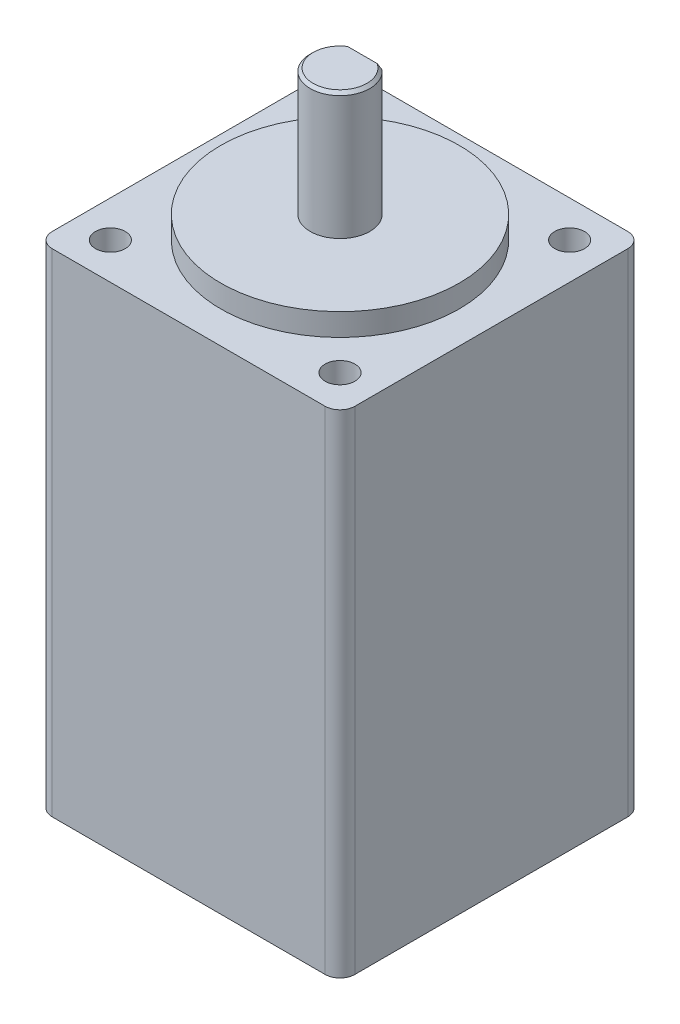
ISO-10303-21;
HEADER;
FILE_DESCRIPTION(('STEP AP214'),'2;1');
FILE_NAME('part.step','',(''),(''),'','','');
FILE_SCHEMA(('AUTOMOTIVE_DESIGN { 1 0 10303 214 1 1 1 1 }'));
ENDSEC;
DATA;
#1=APPLICATION_CONTEXT('core data for automotive mechanical design processes');
#2=APPLICATION_PROTOCOL_DEFINITION('international standard','automotive_design',2000,#1);
#3=PRODUCT_CONTEXT('',#1,'mechanical');
#4=PRODUCT('Part','Part','',(#3));
#5=PRODUCT_RELATED_PRODUCT_CATEGORY('part','',(#4));
#6=PRODUCT_DEFINITION_FORMATION('','',#4);
#7=PRODUCT_DEFINITION_CONTEXT('part definition',#1,'design');
#8=PRODUCT_DEFINITION('design','',#6,#7);
#9=PRODUCT_DEFINITION_SHAPE('','',#8);
#10=(LENGTH_UNIT() NAMED_UNIT(*) SI_UNIT(.MILLI.,.METRE.));
#11=(NAMED_UNIT(*) PLANE_ANGLE_UNIT() SI_UNIT($,.RADIAN.));
#12=(NAMED_UNIT(*) SI_UNIT($,.STERADIAN.) SOLID_ANGLE_UNIT());
#13=UNCERTAINTY_MEASURE_WITH_UNIT(LENGTH_MEASURE(1.E-05),#10,'distance_accuracy_value','');
#14=(GEOMETRIC_REPRESENTATION_CONTEXT(3) GLOBAL_UNCERTAINTY_ASSIGNED_CONTEXT((#13)) GLOBAL_UNIT_ASSIGNED_CONTEXT((#10,
#11,#12)) REPRESENTATION_CONTEXT('',''));
#15=CARTESIAN_POINT('',(0.,0.,0.));
#16=DIRECTION('',(0.,0.,1.));
#17=DIRECTION('',(1.,0.,0.));
#18=AXIS2_PLACEMENT_3D('',#15,#16,#17);
#19=CARTESIAN_POINT('',(0.,33.,0.));
#20=DIRECTION('',(0.,1.,0.));
#21=DIRECTION('',(1.,0.,0.));
#22=AXIS2_PLACEMENT_3D('',#19,#20,#21);
#23=PLANE('',#22);
#24=CARTESIAN_POINT('',(0.,33.,0.));
#25=DIRECTION('',(0.,-1.,0.));
#26=DIRECTION('',(-1.,0.,0.));
#27=AXIS2_PLACEMENT_3D('',#24,#25,#26);
#28=CIRCLE('',#27,8.);
#29=CARTESIAN_POINT('',(8.,33.,0.));
#30=VERTEX_POINT('',#29);
#31=EDGE_CURVE('E238',#30,#30,#28,.T.);
#32=ORIENTED_EDGE('',*,*,#31,.T.);
#33=EDGE_LOOP('',(#32));
#34=FACE_BOUND('',#33,.T.);
#35=CARTESIAN_POINT('',(-7.7,33.,7.7));
#36=DIRECTION('',(0.,-1.,0.));
#37=DIRECTION('',(-1.,0.,0.));
#38=AXIS2_PLACEMENT_3D('',#35,#36,#37);
#39=CIRCLE('',#38,1.);
#40=CARTESIAN_POINT('',(-6.7,33.,7.7));
#41=VERTEX_POINT('',#40);
#42=EDGE_CURVE('E282',#41,#41,#39,.T.);
#43=ORIENTED_EDGE('',*,*,#42,.T.);
#44=EDGE_LOOP('',(#43));
#45=FACE_BOUND('',#44,.T.);
#46=CARTESIAN_POINT('',(7.7,33.,7.7));
#47=DIRECTION('',(0.,-1.,0.));
#48=DIRECTION('',(-1.,0.,0.));
#49=AXIS2_PLACEMENT_3D('',#46,#47,#48);
#50=CIRCLE('',#49,1.);
#51=CARTESIAN_POINT('',(8.7,33.,7.7));
#52=VERTEX_POINT('',#51);
#53=EDGE_CURVE('E377',#52,#52,#50,.T.);
#54=ORIENTED_EDGE('',*,*,#53,.T.);
#55=EDGE_LOOP('',(#54));
#56=FACE_BOUND('',#55,.T.);
#57=CARTESIAN_POINT('',(-7.7,33.,-7.7));
#58=DIRECTION('',(0.,-1.,0.));
#59=DIRECTION('',(-1.,0.,0.));
#60=AXIS2_PLACEMENT_3D('',#57,#58,#59);
#61=CIRCLE('',#60,1.);
#62=CARTESIAN_POINT('',(-6.7,33.,-7.7));
#63=VERTEX_POINT('',#62);
#64=EDGE_CURVE('E288',#63,#63,#61,.T.);
#65=ORIENTED_EDGE('',*,*,#64,.T.);
#66=EDGE_LOOP('',(#65));
#67=FACE_BOUND('',#66,.T.);
#68=CARTESIAN_POINT('',(7.7,33.,-7.7));
#69=DIRECTION('',(0.,-1.,0.));
#70=DIRECTION('',(-1.,0.,0.));
#71=AXIS2_PLACEMENT_3D('',#68,#69,#70);
#72=CIRCLE('',#71,1.);
#73=CARTESIAN_POINT('',(8.7,33.,-7.7));
#74=VERTEX_POINT('',#73);
#75=EDGE_CURVE('E365',#74,#74,#72,.T.);
#76=ORIENTED_EDGE('',*,*,#75,.T.);
#77=EDGE_LOOP('',(#76));
#78=FACE_BOUND('',#77,.T.);
#79=CARTESIAN_POINT('',(-9.15,33.,-9.15));
#80=DIRECTION('',(0.,-1.,0.));
#81=DIRECTION('',(-0.707106781186548,0.,-0.707106781186548));
#82=AXIS2_PLACEMENT_3D('',#79,#80,#81);
#83=CIRCLE('',#82,1.);
#84=CARTESIAN_POINT('',(-10.15,33.,-9.15));
#85=VERTEX_POINT('',#84);
#86=CARTESIAN_POINT('',(-9.15,33.,-10.15));
#87=VERTEX_POINT('',#86);
#88=EDGE_CURVE('E221',#85,#87,#83,.T.);
#89=ORIENTED_EDGE('',*,*,#88,.F.);
#90=DIRECTION('',(0.,0.,1.));
#91=VECTOR('',#90,1.);
#92=CARTESIAN_POINT('',(-10.15,33.,10.15));
#93=LINE('',#92,#91);
#94=CARTESIAN_POINT('',(-10.15,33.,9.15));
#95=VERTEX_POINT('',#94);
#96=EDGE_CURVE('E294',#85,#95,#93,.T.);
#97=ORIENTED_EDGE('',*,*,#96,.T.);
#98=CARTESIAN_POINT('',(-9.15,33.,9.15));
#99=DIRECTION('',(0.,-1.,0.));
#100=DIRECTION('',(-0.707106781186548,0.,0.707106781186548));
#101=AXIS2_PLACEMENT_3D('',#98,#99,#100);
#102=CIRCLE('',#101,1.);
#103=CARTESIAN_POINT('',(-9.15,33.,10.15));
#104=VERTEX_POINT('',#103);
#105=EDGE_CURVE('E274',#104,#95,#102,.T.);
#106=ORIENTED_EDGE('',*,*,#105,.F.);
#107=DIRECTION('',(1.,0.,0.));
#108=VECTOR('',#107,1.);
#109=CARTESIAN_POINT('',(10.15,33.,10.15));
#110=LINE('',#109,#108);
#111=CARTESIAN_POINT('',(9.15,33.,10.15));
#112=VERTEX_POINT('',#111);
#113=EDGE_CURVE('E301',#104,#112,#110,.T.);
#114=ORIENTED_EDGE('',*,*,#113,.T.);
#115=CARTESIAN_POINT('',(9.15,33.,9.15));
#116=DIRECTION('',(0.,-1.,0.));
#117=DIRECTION('',(0.707106781186548,0.,0.707106781186548));
#118=AXIS2_PLACEMENT_3D('',#115,#116,#117);
#119=CIRCLE('',#118,1.);
#120=CARTESIAN_POINT('',(10.15,33.,9.15));
#121=VERTEX_POINT('',#120);
#122=EDGE_CURVE('E226',#121,#112,#119,.T.);
#123=ORIENTED_EDGE('',*,*,#122,.F.);
#124=DIRECTION('',(0.,0.,-1.));
#125=VECTOR('',#124,1.);
#126=CARTESIAN_POINT('',(10.15,33.,-10.15));
#127=LINE('',#126,#125);
#128=CARTESIAN_POINT('',(10.15,33.,-9.15));
#129=VERTEX_POINT('',#128);
#130=EDGE_CURVE('E11',#121,#129,#127,.T.);
#131=ORIENTED_EDGE('',*,*,#130,.T.);
#132=CARTESIAN_POINT('',(9.15,33.,-9.15));
#133=DIRECTION('',(0.,-1.,0.));
#134=DIRECTION('',(0.707106781186548,0.,-0.707106781186548));
#135=AXIS2_PLACEMENT_3D('',#132,#133,#134);
#136=CIRCLE('',#135,1.);
#137=CARTESIAN_POINT('',(9.15,33.,-10.15));
#138=VERTEX_POINT('',#137);
#139=EDGE_CURVE('E223',#138,#129,#136,.T.);
#140=ORIENTED_EDGE('',*,*,#139,.F.);
#141=DIRECTION('',(-1.,0.,0.));
#142=VECTOR('',#141,1.);
#143=CARTESIAN_POINT('',(-10.15,33.,-10.15));
#144=LINE('',#143,#142);
#145=EDGE_CURVE('E218',#138,#87,#144,.T.);
#146=ORIENTED_EDGE('',*,*,#145,.T.);
#147=EDGE_LOOP('',(#89,#97,#106,#114,#123,#131,#140,#146));
#148=FACE_BOUND('',#147,.T.);
#149=ADVANCED_FACE('F17',(#34,#45,#56,#67,#78,#148),#23,.T.);
#150=CARTESIAN_POINT('',(10.15,0.,10.15));
#151=DIRECTION('',(1.,0.,0.));
#152=DIRECTION('',(0.,1.,0.));
#153=AXIS2_PLACEMENT_3D('',#150,#151,#152);
#154=PLANE('',#153);
#155=DIRECTION('',(0.,-1.,0.));
#156=VECTOR('',#155,1.);
#157=CARTESIAN_POINT('',(10.15,0.,-9.15));
#158=LINE('',#157,#156);
#159=CARTESIAN_POINT('',(10.15,0.,-9.15));
#160=VERTEX_POINT('',#159);
#161=EDGE_CURVE('E305',#129,#160,#158,.T.);
#162=ORIENTED_EDGE('',*,*,#161,.F.);
#163=ORIENTED_EDGE('',*,*,#130,.F.);
#164=DIRECTION('',(0.,1.,0.));
#165=VECTOR('',#164,1.);
#166=CARTESIAN_POINT('',(10.15,0.,9.15));
#167=LINE('',#166,#165);
#168=CARTESIAN_POINT('',(10.15,0.,9.15));
#169=VERTEX_POINT('',#168);
#170=EDGE_CURVE('E28',#169,#121,#167,.T.);
#171=ORIENTED_EDGE('',*,*,#170,.F.);
#172=DIRECTION('',(0.,0.,1.));
#173=VECTOR('',#172,1.);
#174=CARTESIAN_POINT('',(10.15,0.,-10.15));
#175=LINE('',#174,#173);
#176=EDGE_CURVE('E252',#160,#169,#175,.T.);
#177=ORIENTED_EDGE('',*,*,#176,.F.);
#178=EDGE_LOOP('',(#162,#163,#171,#177));
#179=FACE_BOUND('',#178,.T.);
#180=ADVANCED_FACE('F551',(#179),#154,.T.);
#181=CARTESIAN_POINT('',(9.15,0.,9.15));
#182=DIRECTION('',(0.,1.,0.));
#183=DIRECTION('',(0.707106781186548,0.,0.707106781186548));
#184=AXIS2_PLACEMENT_3D('',#181,#182,#183);
#185=CYLINDRICAL_SURFACE('',#184,1.);
#186=ORIENTED_EDGE('',*,*,#122,.T.);
#187=DIRECTION('',(0.,-1.,0.));
#188=VECTOR('',#187,1.);
#189=CARTESIAN_POINT('',(9.15,0.,10.15));
#190=LINE('',#189,#188);
#191=CARTESIAN_POINT('',(9.15,0.,10.15));
#192=VERTEX_POINT('',#191);
#193=EDGE_CURVE('E58',#112,#192,#190,.T.);
#194=ORIENTED_EDGE('',*,*,#193,.T.);
#195=CARTESIAN_POINT('',(9.15,0.,9.15));
#196=DIRECTION('',(0.,1.,0.));
#197=DIRECTION('',(0.707106781186548,0.,0.707106781186548));
#198=AXIS2_PLACEMENT_3D('',#195,#196,#197);
#199=CIRCLE('',#198,1.);
#200=EDGE_CURVE('E249',#192,#169,#199,.T.);
#201=ORIENTED_EDGE('',*,*,#200,.T.);
#202=ORIENTED_EDGE('',*,*,#170,.T.);
#203=EDGE_LOOP('',(#186,#194,#201,#202));
#204=FACE_BOUND('',#203,.T.);
#205=ADVANCED_FACE('F546',(#204),#185,.T.);
#206=CARTESIAN_POINT('',(10.15,0.,-10.15));
#207=DIRECTION('',(0.,0.,-1.));
#208=DIRECTION('',(0.,-1.,0.));
#209=AXIS2_PLACEMENT_3D('',#206,#207,#208);
#210=PLANE('',#209);
#211=DIRECTION('',(0.,-1.,0.));
#212=VECTOR('',#211,1.);
#213=CARTESIAN_POINT('',(-9.15,0.,-10.15));
#214=LINE('',#213,#212);
#215=CARTESIAN_POINT('',(-9.15,0.,-10.15));
#216=VERTEX_POINT('',#215);
#217=EDGE_CURVE('E21',#87,#216,#214,.T.);
#218=ORIENTED_EDGE('',*,*,#217,.F.);
#219=ORIENTED_EDGE('',*,*,#145,.F.);
#220=DIRECTION('',(0.,1.,0.));
#221=VECTOR('',#220,1.);
#222=CARTESIAN_POINT('',(9.15,0.,-10.15));
#223=LINE('',#222,#221);
#224=CARTESIAN_POINT('',(9.15,0.,-10.15));
#225=VERTEX_POINT('',#224);
#226=EDGE_CURVE('E227',#225,#138,#223,.T.);
#227=ORIENTED_EDGE('',*,*,#226,.F.);
#228=DIRECTION('',(1.,0.,0.));
#229=VECTOR('',#228,1.);
#230=CARTESIAN_POINT('',(-10.15,0.,-10.15));
#231=LINE('',#230,#229);
#232=EDGE_CURVE('E212',#216,#225,#231,.T.);
#233=ORIENTED_EDGE('',*,*,#232,.F.);
#234=EDGE_LOOP('',(#218,#219,#227,#233));
#235=FACE_BOUND('',#234,.T.);
#236=ADVANCED_FACE('F230',(#235),#210,.T.);
#237=CARTESIAN_POINT('',(9.15,0.,-9.15));
#238=DIRECTION('',(0.,1.,0.));
#239=DIRECTION('',(0.707106781186548,0.,-0.707106781186548));
#240=AXIS2_PLACEMENT_3D('',#237,#238,#239);
#241=CYLINDRICAL_SURFACE('',#240,1.);
#242=ORIENTED_EDGE('',*,*,#139,.T.);
#243=ORIENTED_EDGE('',*,*,#161,.T.);
#244=CARTESIAN_POINT('',(9.15,0.,-9.15));
#245=DIRECTION('',(0.,1.,0.));
#246=DIRECTION('',(0.707106781186548,0.,-0.707106781186548));
#247=AXIS2_PLACEMENT_3D('',#244,#245,#246);
#248=CIRCLE('',#247,1.);
#249=EDGE_CURVE('E326',#160,#225,#248,.T.);
#250=ORIENTED_EDGE('',*,*,#249,.T.);
#251=ORIENTED_EDGE('',*,*,#226,.T.);
#252=EDGE_LOOP('',(#242,#243,#250,#251));
#253=FACE_BOUND('',#252,.T.);
#254=ADVANCED_FACE('F593',(#253),#241,.T.);
#255=CARTESIAN_POINT('',(-10.15,0.,10.15));
#256=DIRECTION('',(0.,0.,1.));
#257=DIRECTION('',(1.,0.,0.));
#258=AXIS2_PLACEMENT_3D('',#255,#256,#257);
#259=PLANE('',#258);
#260=DIRECTION('',(0.,1.,0.));
#261=VECTOR('',#260,1.);
#262=CARTESIAN_POINT('',(-9.15,0.,10.15));
#263=LINE('',#262,#261);
#264=CARTESIAN_POINT('',(-9.15,0.,10.15));
#265=VERTEX_POINT('',#264);
#266=EDGE_CURVE('E302',#265,#104,#263,.T.);
#267=ORIENTED_EDGE('',*,*,#266,.F.);
#268=DIRECTION('',(-1.,0.,0.));
#269=VECTOR('',#268,1.);
#270=CARTESIAN_POINT('',(10.15,0.,10.15));
#271=LINE('',#270,#269);
#272=EDGE_CURVE('E251',#192,#265,#271,.T.);
#273=ORIENTED_EDGE('',*,*,#272,.F.);
#274=ORIENTED_EDGE('',*,*,#193,.F.);
#275=ORIENTED_EDGE('',*,*,#113,.F.);
#276=EDGE_LOOP('',(#267,#273,#274,#275));
#277=FACE_BOUND('',#276,.T.);
#278=ADVANCED_FACE('F563',(#277),#259,.T.);
#279=CARTESIAN_POINT('',(-9.15,0.,9.15));
#280=DIRECTION('',(0.,1.,0.));
#281=DIRECTION('',(-0.707106781186548,0.,0.707106781186548));
#282=AXIS2_PLACEMENT_3D('',#279,#280,#281);
#283=CYLINDRICAL_SURFACE('',#282,1.);
#284=ORIENTED_EDGE('',*,*,#105,.T.);
#285=DIRECTION('',(0.,-1.,0.));
#286=VECTOR('',#285,1.);
#287=CARTESIAN_POINT('',(-10.15,0.,9.15));
#288=LINE('',#287,#286);
#289=CARTESIAN_POINT('',(-10.15,0.,9.15));
#290=VERTEX_POINT('',#289);
#291=EDGE_CURVE('E290',#95,#290,#288,.T.);
#292=ORIENTED_EDGE('',*,*,#291,.T.);
#293=CARTESIAN_POINT('',(-9.15,0.,9.15));
#294=DIRECTION('',(0.,1.,0.));
#295=DIRECTION('',(-0.707106781186548,0.,0.707106781186548));
#296=AXIS2_PLACEMENT_3D('',#293,#294,#295);
#297=CIRCLE('',#296,1.);
#298=EDGE_CURVE('E271',#290,#265,#297,.T.);
#299=ORIENTED_EDGE('',*,*,#298,.T.);
#300=ORIENTED_EDGE('',*,*,#266,.T.);
#301=EDGE_LOOP('',(#284,#292,#299,#300));
#302=FACE_BOUND('',#301,.T.);
#303=ADVANCED_FACE('F557',(#302),#283,.T.);
#304=CARTESIAN_POINT('',(0.,0.,0.));
#305=DIRECTION('',(0.,1.,0.));
#306=DIRECTION('',(1.,0.,0.));
#307=AXIS2_PLACEMENT_3D('',#304,#305,#306);
#308=PLANE('',#307);
#309=CARTESIAN_POINT('',(-9.15,0.,-9.15));
#310=DIRECTION('',(0.,1.,0.));
#311=DIRECTION('',(-0.707106781186548,0.,-0.707106781186548));
#312=AXIS2_PLACEMENT_3D('',#309,#310,#311);
#313=CIRCLE('',#312,1.);
#314=CARTESIAN_POINT('',(-10.15,0.,-9.15));
#315=VERTEX_POINT('',#314);
#316=EDGE_CURVE('E234',#216,#315,#313,.T.);
#317=ORIENTED_EDGE('',*,*,#316,.F.);
#318=ORIENTED_EDGE('',*,*,#232,.T.);
#319=ORIENTED_EDGE('',*,*,#249,.F.);
#320=ORIENTED_EDGE('',*,*,#176,.T.);
#321=ORIENTED_EDGE('',*,*,#200,.F.);
#322=ORIENTED_EDGE('',*,*,#272,.T.);
#323=ORIENTED_EDGE('',*,*,#298,.F.);
#324=DIRECTION('',(0.,0.,-1.));
#325=VECTOR('',#324,1.);
#326=CARTESIAN_POINT('',(-10.15,0.,10.15));
#327=LINE('',#326,#325);
#328=EDGE_CURVE('E201',#290,#315,#327,.T.);
#329=ORIENTED_EDGE('',*,*,#328,.T.);
#330=EDGE_LOOP('',(#317,#318,#319,#320,#321,#322,#323,#329));
#331=FACE_BOUND('',#330,.T.);
#332=ADVANCED_FACE('F562',(#331),#308,.F.);
#333=CARTESIAN_POINT('',(-10.15,0.,-10.15));
#334=DIRECTION('',(-1.,0.,0.));
#335=DIRECTION('',(0.,0.,1.));
#336=AXIS2_PLACEMENT_3D('',#333,#334,#335);
#337=PLANE('',#336);
#338=DIRECTION('',(0.,1.,0.));
#339=VECTOR('',#338,1.);
#340=CARTESIAN_POINT('',(-10.15,0.,-9.15));
#341=LINE('',#340,#339);
#342=EDGE_CURVE('E236',#315,#85,#341,.T.);
#343=ORIENTED_EDGE('',*,*,#342,.F.);
#344=ORIENTED_EDGE('',*,*,#328,.F.);
#345=ORIENTED_EDGE('',*,*,#291,.F.);
#346=ORIENTED_EDGE('',*,*,#96,.F.);
#347=EDGE_LOOP('',(#343,#344,#345,#346));
#348=FACE_BOUND('',#347,.T.);
#349=ADVANCED_FACE('F611',(#348),#337,.T.);
#350=CARTESIAN_POINT('',(-9.15,0.,-9.15));
#351=DIRECTION('',(0.,1.,0.));
#352=DIRECTION('',(-0.707106781186548,0.,-0.707106781186548));
#353=AXIS2_PLACEMENT_3D('',#350,#351,#352);
#354=CYLINDRICAL_SURFACE('',#353,1.);
#355=ORIENTED_EDGE('',*,*,#88,.T.);
#356=ORIENTED_EDGE('',*,*,#217,.T.);
#357=ORIENTED_EDGE('',*,*,#316,.T.);
#358=ORIENTED_EDGE('',*,*,#342,.T.);
#359=EDGE_LOOP('',(#355,#356,#357,#358));
#360=FACE_BOUND('',#359,.T.);
#361=ADVANCED_FACE('F19',(#360),#354,.T.);
#362=CARTESIAN_POINT('',(0.,34.5,0.));
#363=DIRECTION('',(0.,1.,0.));
#364=DIRECTION('',(1.,0.,0.));
#365=AXIS2_PLACEMENT_3D('',#362,#363,#364);
#366=PLANE('',#365);
#367=CARTESIAN_POINT('',(0.,34.5,0.));
#368=DIRECTION('',(0.,-1.,0.));
#369=DIRECTION('',(-1.,0.,0.));
#370=AXIS2_PLACEMENT_3D('',#367,#368,#369);
#371=CIRCLE('',#370,2.);
#372=CARTESIAN_POINT('',(2.,34.5,0.));
#373=VERTEX_POINT('',#372);
#374=EDGE_CURVE('E268',#373,#373,#371,.T.);
#375=ORIENTED_EDGE('',*,*,#374,.T.);
#376=EDGE_LOOP('',(#375));
#377=FACE_BOUND('',#376,.T.);
#378=CARTESIAN_POINT('',(0.,34.5,0.));
#379=DIRECTION('',(0.,1.,0.));
#380=DIRECTION('',(-1.,0.,0.));
#381=AXIS2_PLACEMENT_3D('',#378,#379,#380);
#382=CIRCLE('',#381,8.);
#383=CARTESIAN_POINT('',(8.,34.5,0.));
#384=VERTEX_POINT('',#383);
#385=EDGE_CURVE('E298',#384,#384,#382,.T.);
#386=ORIENTED_EDGE('',*,*,#385,.T.);
#387=EDGE_LOOP('',(#386));
#388=FACE_BOUND('',#387,.T.);
#389=ADVANCED_FACE('F586',(#377,#388),#366,.T.);
#390=CARTESIAN_POINT('',(0.,33.,0.));
#391=DIRECTION('',(0.,1.,0.));
#392=DIRECTION('',(-1.,0.,0.));
#393=AXIS2_PLACEMENT_3D('',#390,#391,#392);
#394=CYLINDRICAL_SURFACE('',#393,8.);
#395=ORIENTED_EDGE('',*,*,#385,.F.);
#396=DIRECTION('',(0.,-1.,0.));
#397=VECTOR('',#396,1.);
#398=CARTESIAN_POINT('',(8.,33.,0.));
#399=LINE('',#398,#397);
#400=EDGE_CURVE('E244',#384,#30,#399,.T.);
#401=ORIENTED_EDGE('',*,*,#400,.T.);
#402=ORIENTED_EDGE('',*,*,#31,.F.);
#403=ORIENTED_EDGE('',*,*,#400,.F.);
#404=EDGE_LOOP('',(#395,#401,#402,#403));
#405=FACE_BOUND('',#404,.T.);
#406=ADVANCED_FACE('F580',(#405),#394,.T.);
#407=CARTESIAN_POINT('',(0.,34.5,0.));
#408=DIRECTION('',(0.,1.,0.));
#409=DIRECTION('',(-1.,0.,0.));
#410=AXIS2_PLACEMENT_3D('',#407,#408,#409);
#411=CYLINDRICAL_SURFACE('',#410,2.);
#412=CARTESIAN_POINT('',(0.,42.8,0.));
#413=DIRECTION('',(0.,1.,0.));
#414=DIRECTION('',(-1.,0.,0.));
#415=AXIS2_PLACEMENT_3D('',#412,#413,#414);
#416=CIRCLE('',#415,2.);
#417=CARTESIAN_POINT('',(-1.3228756555323,42.8,-1.5));
#418=VERTEX_POINT('',#417);
#419=CARTESIAN_POINT('',(2.,42.8,0.));
#420=VERTEX_POINT('',#419);
#421=EDGE_CURVE('E258',#418,#420,#416,.T.);
#422=ORIENTED_EDGE('',*,*,#421,.F.);
#423=DIRECTION('',(0.,-1.,0.));
#424=VECTOR('',#423,1.);
#425=CARTESIAN_POINT('',(-1.3228756555323,34.5,-1.5));
#426=LINE('',#425,#424);
#427=CARTESIAN_POINT('',(-1.3228756555323,36.,-1.5));
#428=VERTEX_POINT('',#427);
#429=EDGE_CURVE('E254',#418,#428,#426,.T.);
#430=ORIENTED_EDGE('',*,*,#429,.T.);
#431=CARTESIAN_POINT('',(0.,36.,0.));
#432=DIRECTION('',(0.,-1.,0.));
#433=DIRECTION('',(-1.,0.,0.));
#434=AXIS2_PLACEMENT_3D('',#431,#432,#433);
#435=CIRCLE('',#434,2.);
#436=CARTESIAN_POINT('',(1.3228756555323,36.,-1.5));
#437=VERTEX_POINT('',#436);
#438=EDGE_CURVE('E103',#428,#437,#435,.T.);
#439=ORIENTED_EDGE('',*,*,#438,.T.);
#440=DIRECTION('',(0.,1.,0.));
#441=VECTOR('',#440,1.);
#442=CARTESIAN_POINT('',(1.3228756555323,34.5,-1.5));
#443=LINE('',#442,#441);
#444=CARTESIAN_POINT('',(1.3228756555323,42.8,-1.5));
#445=VERTEX_POINT('',#444);
#446=EDGE_CURVE('E170',#437,#445,#443,.T.);
#447=ORIENTED_EDGE('',*,*,#446,.T.);
#448=CARTESIAN_POINT('',(0.,42.8,0.));
#449=DIRECTION('',(0.,1.,0.));
#450=DIRECTION('',(-1.,0.,0.));
#451=AXIS2_PLACEMENT_3D('',#448,#449,#450);
#452=CIRCLE('',#451,2.);
#453=EDGE_CURVE('E262',#420,#445,#452,.T.);
#454=ORIENTED_EDGE('',*,*,#453,.F.);
#455=DIRECTION('',(0.,-1.,0.));
#456=VECTOR('',#455,1.);
#457=CARTESIAN_POINT('',(2.,34.5,0.));
#458=LINE('',#457,#456);
#459=EDGE_CURVE('E264',#420,#373,#458,.T.);
#460=ORIENTED_EDGE('',*,*,#459,.T.);
#461=ORIENTED_EDGE('',*,*,#374,.F.);
#462=ORIENTED_EDGE('',*,*,#459,.F.);
#463=EDGE_LOOP('',(#422,#430,#439,#447,#454,#460,#461,#462));
#464=FACE_BOUND('',#463,.T.);
#465=ADVANCED_FACE('F585',(#464),#411,.T.);
#466=CARTESIAN_POINT('',(0.,36.,-1.75));
#467=DIRECTION('',(0.,1.,0.));
#468=DIRECTION('',(1.,0.,0.));
#469=AXIS2_PLACEMENT_3D('',#466,#467,#468);
#470=PLANE('',#469);
#471=DIRECTION('',(-1.,0.,0.));
#472=VECTOR('',#471,1.);
#473=CARTESIAN_POINT('',(-1.3228756555323,36.,-1.5));
#474=LINE('',#473,#472);
#475=EDGE_CURVE('E257',#437,#428,#474,.T.);
#476=ORIENTED_EDGE('',*,*,#475,.F.);
#477=ORIENTED_EDGE('',*,*,#438,.F.);
#478=EDGE_LOOP('',(#476,#477));
#479=FACE_BOUND('',#478,.T.);
#480=ADVANCED_FACE('F619',(#479),#470,.T.);
#481=CARTESIAN_POINT('',(1.3228756555323,43.,-1.5));
#482=DIRECTION('',(0.,0.,1.));
#483=DIRECTION('',(1.,0.,0.));
#484=AXIS2_PLACEMENT_3D('',#481,#482,#483);
#485=PLANE('',#484);
#486=CARTESIAN_POINT('',(-0.994987437106619,43.,-1.5));
#487=CARTESIAN_POINT('',(-1.15030290899246,42.914146142603,-1.5));
#488=CARTESIAN_POINT('',(-1.3228756555323,42.8,-1.5));
#489=(BOUNDED_CURVE() B_SPLINE_CURVE(2,(#486,#487,#488),.UNSPECIFIED.,.F.,
.F.) B_SPLINE_CURVE_WITH_KNOTS((3,3),(0.,0.0887251849927378),
.UNSPECIFIED.) CURVE() GEOMETRIC_REPRESENTATION_ITEM() RATIONAL_B_SPLINE_CURVE((1.,
1.03840266402944,1.07025193268622)) REPRESENTATION_ITEM(''));
#490=CARTESIAN_POINT('',(-0.994987437106619,43.,-1.5));
#491=VERTEX_POINT('',#490);
#492=EDGE_CURVE('E263',#491,#418,#489,.T.);
#493=ORIENTED_EDGE('',*,*,#492,.F.);
#494=DIRECTION('',(-1.,0.,0.));
#495=VECTOR('',#494,1.);
#496=CARTESIAN_POINT('',(0.661437827766148,43.,-1.5));
#497=LINE('',#496,#495);
#498=CARTESIAN_POINT('',(0.99498743710662,43.,-1.5));
#499=VERTEX_POINT('',#498);
#500=EDGE_CURVE('E178',#499,#491,#497,.T.);
#501=ORIENTED_EDGE('',*,*,#500,.F.);
#502=CARTESIAN_POINT('',(1.3228756555323,42.8,-1.5));
#503=CARTESIAN_POINT('',(1.15030290897698,42.9141461426146,-1.5));
#504=CARTESIAN_POINT('',(0.99498743710662,43.,-1.5));
#505=(BOUNDED_CURVE() B_SPLINE_CURVE(2,(#502,#503,#504),.UNSPECIFIED.,.F.,
.F.) B_SPLINE_CURVE_WITH_KNOTS((3,3),(0.951127677971243,1.03985286297139),
.UNSPECIFIED.) CURVE() GEOMETRIC_REPRESENTATION_ITEM() RATIONAL_B_SPLINE_CURVE((1.07025193269154,
1.03840266403265,1.)) REPRESENTATION_ITEM(''));
#506=EDGE_CURVE('E346',#445,#499,#505,.T.);
#507=ORIENTED_EDGE('',*,*,#506,.F.);
#508=ORIENTED_EDGE('',*,*,#446,.F.);
#509=ORIENTED_EDGE('',*,*,#475,.T.);
#510=ORIENTED_EDGE('',*,*,#429,.F.);
#511=EDGE_LOOP('',(#493,#501,#507,#508,#509,#510));
#512=FACE_BOUND('',#511,.T.);
#513=ADVANCED_FACE('F575',(#512),#485,.F.);
#514=CARTESIAN_POINT('',(0.,43.,0.));
#515=DIRECTION('',(0.,1.,0.));
#516=DIRECTION('',(1.,0.,0.));
#517=AXIS2_PLACEMENT_3D('',#514,#515,#516);
#518=PLANE('',#517);
#519=CARTESIAN_POINT('',(0.,43.,0.));
#520=DIRECTION('',(0.,-1.,0.));
#521=DIRECTION('',(-1.,0.,0.));
#522=AXIS2_PLACEMENT_3D('',#519,#520,#521);
#523=CIRCLE('',#522,1.8);
#524=EDGE_CURVE('E311',#499,#491,#523,.T.);
#525=ORIENTED_EDGE('',*,*,#524,.F.);
#526=ORIENTED_EDGE('',*,*,#500,.T.);
#527=EDGE_LOOP('',(#525,#526));
#528=FACE_BOUND('',#527,.T.);
#529=ADVANCED_FACE('F570',(#528),#518,.T.);
#530=CARTESIAN_POINT('',(0.,42.9,0.));
#531=DIRECTION('',(0.,-1.,0.));
#532=DIRECTION('',(0.,0.,1.));
#533=AXIS2_PLACEMENT_3D('',#530,#531,#532);
#534=CONICAL_SURFACE('',#533,1.9,0.785398163397459);
#535=ORIENTED_EDGE('',*,*,#506,.T.);
#536=ORIENTED_EDGE('',*,*,#524,.T.);
#537=ORIENTED_EDGE('',*,*,#492,.T.);
#538=ORIENTED_EDGE('',*,*,#421,.T.);
#539=ORIENTED_EDGE('',*,*,#453,.T.);
#540=EDGE_LOOP('',(#535,#536,#537,#538,#539));
#541=FACE_BOUND('',#540,.T.);
#542=ADVANCED_FACE('F540',(#541),#534,.T.);
#543=CARTESIAN_POINT('',(-7.7,30.5,7.7));
#544=DIRECTION('',(0.,1.,0.));
#545=DIRECTION('',(1.,0.,0.));
#546=AXIS2_PLACEMENT_3D('',#543,#544,#545);
#547=PLANE('',#546);
#548=CARTESIAN_POINT('',(-7.7,30.5,7.7));
#549=DIRECTION('',(0.,-1.,0.));
#550=DIRECTION('',(-1.,0.,0.));
#551=AXIS2_PLACEMENT_3D('',#548,#549,#550);
#552=CIRCLE('',#551,1.);
#553=CARTESIAN_POINT('',(-6.7,30.5,7.7));
#554=VERTEX_POINT('',#553);
#555=EDGE_CURVE('E281',#554,#554,#552,.T.);
#556=ORIENTED_EDGE('',*,*,#555,.F.);
#557=EDGE_LOOP('',(#556));
#558=FACE_BOUND('',#557,.T.);
#559=ADVANCED_FACE('F535',(#558),#547,.T.);
#560=CARTESIAN_POINT('',(-7.7,33.,7.7));
#561=DIRECTION('',(0.,-1.,0.));
#562=DIRECTION('',(-1.,0.,0.));
#563=AXIS2_PLACEMENT_3D('',#560,#561,#562);
#564=CYLINDRICAL_SURFACE('',#563,1.);
#565=ORIENTED_EDGE('',*,*,#42,.F.);
#566=DIRECTION('',(0.,-1.,0.));
#567=VECTOR('',#566,1.);
#568=CARTESIAN_POINT('',(-6.7,33.,7.7));
#569=LINE('',#568,#567);
#570=EDGE_CURVE('E131',#41,#554,#569,.T.);
#571=ORIENTED_EDGE('',*,*,#570,.T.);
#572=ORIENTED_EDGE('',*,*,#555,.T.);
#573=ORIENTED_EDGE('',*,*,#570,.F.);
#574=EDGE_LOOP('',(#565,#571,#572,#573));
#575=FACE_BOUND('',#574,.T.);
#576=ADVANCED_FACE('F519',(#575),#564,.F.);
#577=CARTESIAN_POINT('',(7.7,30.5,7.7));
#578=DIRECTION('',(0.,1.,0.));
#579=DIRECTION('',(1.,0.,0.));
#580=AXIS2_PLACEMENT_3D('',#577,#578,#579);
#581=PLANE('',#580);
#582=CARTESIAN_POINT('',(7.7,30.5,7.7));
#583=DIRECTION('',(0.,-1.,0.));
#584=DIRECTION('',(-1.,0.,0.));
#585=AXIS2_PLACEMENT_3D('',#582,#583,#584);
#586=CIRCLE('',#585,1.);
#587=CARTESIAN_POINT('',(8.7,30.5,7.7));
#588=VERTEX_POINT('',#587);
#589=EDGE_CURVE('E143',#588,#588,#586,.T.);
#590=ORIENTED_EDGE('',*,*,#589,.F.);
#591=EDGE_LOOP('',(#590));
#592=FACE_BOUND('',#591,.T.);
#593=ADVANCED_FACE('F513',(#592),#581,.T.);
#594=CARTESIAN_POINT('',(7.7,33.,7.7));
#595=DIRECTION('',(0.,-1.,0.));
#596=DIRECTION('',(-1.,0.,0.));
#597=AXIS2_PLACEMENT_3D('',#594,#595,#596);
#598=CYLINDRICAL_SURFACE('',#597,1.);
#599=ORIENTED_EDGE('',*,*,#53,.F.);
#600=DIRECTION('',(0.,-1.,0.));
#601=VECTOR('',#600,1.);
#602=CARTESIAN_POINT('',(8.7,33.,7.7));
#603=LINE('',#602,#601);
#604=EDGE_CURVE('E336',#52,#588,#603,.T.);
#605=ORIENTED_EDGE('',*,*,#604,.T.);
#606=ORIENTED_EDGE('',*,*,#589,.T.);
#607=ORIENTED_EDGE('',*,*,#604,.F.);
#608=EDGE_LOOP('',(#599,#605,#606,#607));
#609=FACE_BOUND('',#608,.T.);
#610=ADVANCED_FACE('F518',(#609),#598,.F.);
#611=CARTESIAN_POINT('',(-7.7,30.5,-7.7));
#612=DIRECTION('',(0.,1.,0.));
#613=DIRECTION('',(1.,0.,0.));
#614=AXIS2_PLACEMENT_3D('',#611,#612,#613);
#615=PLANE('',#614);
#616=CARTESIAN_POINT('',(-7.7,30.5,-7.7));
#617=DIRECTION('',(0.,-1.,0.));
#618=DIRECTION('',(-1.,0.,0.));
#619=AXIS2_PLACEMENT_3D('',#616,#617,#618);
#620=CIRCLE('',#619,1.);
#621=CARTESIAN_POINT('',(-6.7,30.5,-7.7));
#622=VERTEX_POINT('',#621);
#623=EDGE_CURVE('E319',#622,#622,#620,.T.);
#624=ORIENTED_EDGE('',*,*,#623,.F.);
#625=EDGE_LOOP('',(#624));
#626=FACE_BOUND('',#625,.T.);
#627=ADVANCED_FACE('F506',(#626),#615,.T.);
#628=CARTESIAN_POINT('',(-7.7,33.,-7.7));
#629=DIRECTION('',(0.,-1.,0.));
#630=DIRECTION('',(-1.,0.,0.));
#631=AXIS2_PLACEMENT_3D('',#628,#629,#630);
#632=CYLINDRICAL_SURFACE('',#631,1.);
#633=ORIENTED_EDGE('',*,*,#64,.F.);
#634=DIRECTION('',(0.,-1.,0.));
#635=VECTOR('',#634,1.);
#636=CARTESIAN_POINT('',(-6.7,33.,-7.7));
#637=LINE('',#636,#635);
#638=EDGE_CURVE('E312',#63,#622,#637,.T.);
#639=ORIENTED_EDGE('',*,*,#638,.T.);
#640=ORIENTED_EDGE('',*,*,#623,.T.);
#641=ORIENTED_EDGE('',*,*,#638,.F.);
#642=EDGE_LOOP('',(#633,#639,#640,#641));
#643=FACE_BOUND('',#642,.T.);
#644=ADVANCED_FACE('F500',(#643),#632,.F.);
#645=CARTESIAN_POINT('',(7.7,30.5,-7.7));
#646=DIRECTION('',(0.,1.,0.));
#647=DIRECTION('',(1.,0.,0.));
#648=AXIS2_PLACEMENT_3D('',#645,#646,#647);
#649=PLANE('',#648);
#650=CARTESIAN_POINT('',(7.7,30.5,-7.7));
#651=DIRECTION('',(0.,-1.,0.));
#652=DIRECTION('',(-1.,0.,0.));
#653=AXIS2_PLACEMENT_3D('',#650,#651,#652);
#654=CIRCLE('',#653,1.);
#655=CARTESIAN_POINT('',(8.7,30.5,-7.7));
#656=VERTEX_POINT('',#655);
#657=EDGE_CURVE('E285',#656,#656,#654,.T.);
#658=ORIENTED_EDGE('',*,*,#657,.F.);
#659=EDGE_LOOP('',(#658));
#660=FACE_BOUND('',#659,.T.);
#661=ADVANCED_FACE('F505',(#660),#649,.T.);
#662=CARTESIAN_POINT('',(7.7,33.,-7.7));
#663=DIRECTION('',(0.,-1.,0.));
#664=DIRECTION('',(-1.,0.,0.));
#665=AXIS2_PLACEMENT_3D('',#662,#663,#664);
#666=CYLINDRICAL_SURFACE('',#665,1.);
#667=ORIENTED_EDGE('',*,*,#75,.F.);
#668=DIRECTION('',(0.,-1.,0.));
#669=VECTOR('',#668,1.);
#670=CARTESIAN_POINT('',(8.7,33.,-7.7));
#671=LINE('',#670,#669);
#672=EDGE_CURVE('E289',#74,#656,#671,.T.);
#673=ORIENTED_EDGE('',*,*,#672,.T.);
#674=ORIENTED_EDGE('',*,*,#657,.T.);
#675=ORIENTED_EDGE('',*,*,#672,.F.);
#676=EDGE_LOOP('',(#667,#673,#674,#675));
#677=FACE_BOUND('',#676,.T.);
#678=ADVANCED_FACE('F529',(#677),#666,.F.);
#679=CLOSED_SHELL('',(#149,#180,#205,#236,#254,#278,#303,#332,#349,#361,#389,#406,#465,#480,
#513,#529,#542,#559,#576,#593,#610,#627,#644,#661,#678));
#680=MANIFOLD_SOLID_BREP('B1',#679);
#681=ADVANCED_BREP_SHAPE_REPRESENTATION('',(#18,#680),#14);
#682=SHAPE_DEFINITION_REPRESENTATION(#9,#681);
ENDSEC;
END-ISO-10303-21;
